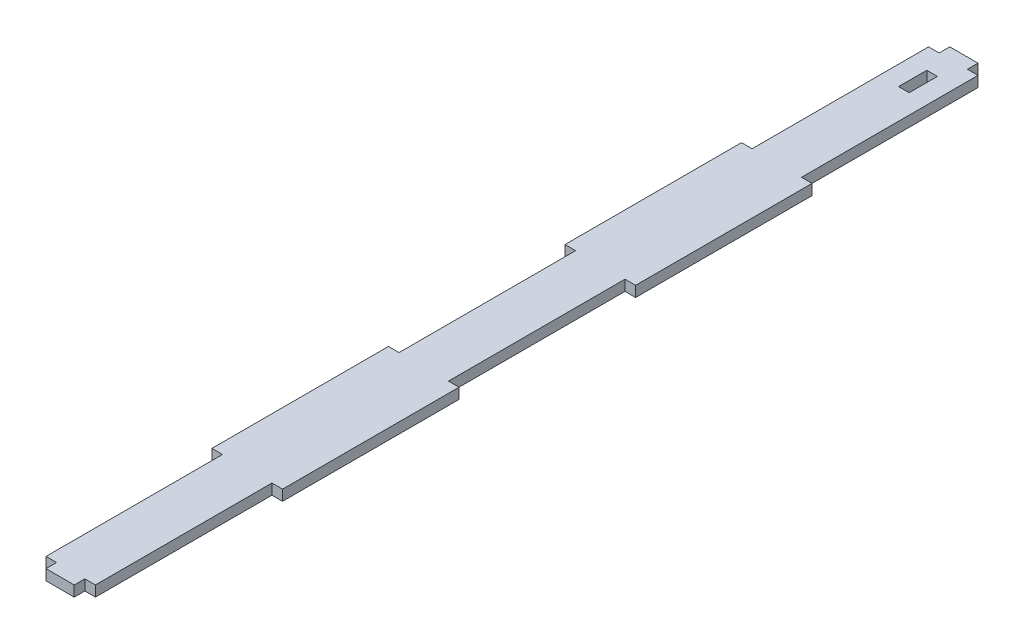
ISO-10303-21;
HEADER;
FILE_DESCRIPTION(('STEP AP214'),'2;1');
FILE_NAME('part.step','',(''),(''),'','','');
FILE_SCHEMA(('AUTOMOTIVE_DESIGN { 1 0 10303 214 1 1 1 1 }'));
ENDSEC;
DATA;
#1=APPLICATION_CONTEXT('core data for automotive mechanical design processes');
#2=APPLICATION_PROTOCOL_DEFINITION('international standard','automotive_design',2000,#1);
#3=PRODUCT_CONTEXT('',#1,'mechanical');
#4=PRODUCT('Part','Part','',(#3));
#5=PRODUCT_RELATED_PRODUCT_CATEGORY('part','',(#4));
#6=PRODUCT_DEFINITION_FORMATION('','',#4);
#7=PRODUCT_DEFINITION_CONTEXT('part definition',#1,'design');
#8=PRODUCT_DEFINITION('design','',#6,#7);
#9=PRODUCT_DEFINITION_SHAPE('','',#8);
#10=(LENGTH_UNIT() NAMED_UNIT(*) SI_UNIT(.MILLI.,.METRE.));
#11=(NAMED_UNIT(*) PLANE_ANGLE_UNIT() SI_UNIT($,.RADIAN.));
#12=(NAMED_UNIT(*) SI_UNIT($,.STERADIAN.) SOLID_ANGLE_UNIT());
#13=UNCERTAINTY_MEASURE_WITH_UNIT(LENGTH_MEASURE(1.E-05),#10,'distance_accuracy_value','');
#14=(GEOMETRIC_REPRESENTATION_CONTEXT(3) GLOBAL_UNCERTAINTY_ASSIGNED_CONTEXT((#13)) GLOBAL_UNIT_ASSIGNED_CONTEXT((#10,
#11,#12)) REPRESENTATION_CONTEXT('',''));
#15=CARTESIAN_POINT('',(0.,0.,0.));
#16=DIRECTION('',(0.,0.,1.));
#17=DIRECTION('',(1.,0.,0.));
#18=AXIS2_PLACEMENT_3D('',#15,#16,#17);
#19=CARTESIAN_POINT('',(2.99999999999996,3.,0.));
#20=DIRECTION('',(-1.,0.,0.));
#21=DIRECTION('',(0.,0.,1.));
#22=AXIS2_PLACEMENT_3D('',#19,#20,#21);
#23=PLANE('',#22);
#24=DIRECTION('',(0.,0.,-1.));
#25=VECTOR('',#24,1.);
#26=CARTESIAN_POINT('',(2.99999999999996,0.,0.));
#27=LINE('',#26,#25);
#28=CARTESIAN_POINT('',(2.99999999999996,0.,-200.116176228397));
#29=VERTEX_POINT('',#28);
#30=CARTESIAN_POINT('',(3.,0.,-250.116176228397));
#31=VERTEX_POINT('',#30);
#32=EDGE_CURVE('E295',#29,#31,#27,.T.);
#33=ORIENTED_EDGE('',*,*,#32,.F.);
#34=DIRECTION('',(0.,-1.,0.));
#35=VECTOR('',#34,1.);
#36=CARTESIAN_POINT('',(2.99999999999996,3.,-200.116176228397));
#37=LINE('',#36,#35);
#38=CARTESIAN_POINT('',(2.99999999999996,3.,-200.116176228397));
#39=VERTEX_POINT('',#38);
#40=EDGE_CURVE('E11',#39,#29,#37,.T.);
#41=ORIENTED_EDGE('',*,*,#40,.F.);
#42=DIRECTION('',(0.,0.,-1.));
#43=VECTOR('',#42,1.);
#44=CARTESIAN_POINT('',(2.99999999999996,3.,0.));
#45=LINE('',#44,#43);
#46=CARTESIAN_POINT('',(3.,3.,-250.116176228397));
#47=VERTEX_POINT('',#46);
#48=EDGE_CURVE('E452',#39,#47,#45,.T.);
#49=ORIENTED_EDGE('',*,*,#48,.T.);
#50=DIRECTION('',(0.,-1.,0.));
#51=VECTOR('',#50,1.);
#52=CARTESIAN_POINT('',(3.,3.,-250.116176228397));
#53=LINE('',#52,#51);
#54=EDGE_CURVE('E161',#47,#31,#53,.T.);
#55=ORIENTED_EDGE('',*,*,#54,.T.);
#56=EDGE_LOOP('',(#33,#41,#49,#55));
#57=FACE_BOUND('',#56,.T.);
#58=ADVANCED_FACE('F35',(#57),#23,.T.);
#59=CARTESIAN_POINT('',(0.,3.,-200.116176228397));
#60=DIRECTION('',(0.,0.,1.));
#61=DIRECTION('',(1.,0.,0.));
#62=AXIS2_PLACEMENT_3D('',#59,#60,#61);
#63=PLANE('',#62);
#64=DIRECTION('',(-1.,0.,0.));
#65=VECTOR('',#64,1.);
#66=CARTESIAN_POINT('',(0.,0.,-200.116176228397));
#67=LINE('',#66,#65);
#68=CARTESIAN_POINT('',(0.,0.,-200.116176228397));
#69=VERTEX_POINT('',#68);
#70=EDGE_CURVE('E297',#29,#69,#67,.T.);
#71=ORIENTED_EDGE('',*,*,#70,.T.);
#72=DIRECTION('',(0.,-1.,0.));
#73=VECTOR('',#72,1.);
#74=CARTESIAN_POINT('',(0.,3.,-200.116176228397));
#75=LINE('',#74,#73);
#76=CARTESIAN_POINT('',(0.,3.,-200.116176228397));
#77=VERTEX_POINT('',#76);
#78=EDGE_CURVE('E45',#77,#69,#75,.T.);
#79=ORIENTED_EDGE('',*,*,#78,.F.);
#80=DIRECTION('',(-1.,0.,0.));
#81=VECTOR('',#80,1.);
#82=CARTESIAN_POINT('',(0.,3.,-200.116176228397));
#83=LINE('',#82,#81);
#84=EDGE_CURVE('E454',#39,#77,#83,.T.);
#85=ORIENTED_EDGE('',*,*,#84,.F.);
#86=ORIENTED_EDGE('',*,*,#40,.T.);
#87=EDGE_LOOP('',(#71,#79,#85,#86));
#88=FACE_BOUND('',#87,.T.);
#89=ADVANCED_FACE('F537',(#88),#63,.F.);
#90=CARTESIAN_POINT('',(0.,3.,0.));
#91=DIRECTION('',(1.,0.,0.));
#92=DIRECTION('',(0.,0.,-1.));
#93=AXIS2_PLACEMENT_3D('',#90,#91,#92);
#94=PLANE('',#93);
#95=DIRECTION('',(0.,0.,1.));
#96=VECTOR('',#95,1.);
#97=CARTESIAN_POINT('',(0.,0.,0.));
#98=LINE('',#97,#96);
#99=CARTESIAN_POINT('',(0.,0.,-150.116176228397));
#100=VERTEX_POINT('',#99);
#101=EDGE_CURVE('E300',#69,#100,#98,.T.);
#102=ORIENTED_EDGE('',*,*,#101,.T.);
#103=DIRECTION('',(0.,-1.,0.));
#104=VECTOR('',#103,1.);
#105=CARTESIAN_POINT('',(0.,3.,-150.116176228397));
#106=LINE('',#105,#104);
#107=CARTESIAN_POINT('',(0.,3.,-150.116176228397));
#108=VERTEX_POINT('',#107);
#109=EDGE_CURVE('E422',#108,#100,#106,.T.);
#110=ORIENTED_EDGE('',*,*,#109,.F.);
#111=DIRECTION('',(0.,0.,1.));
#112=VECTOR('',#111,1.);
#113=CARTESIAN_POINT('',(0.,3.,0.));
#114=LINE('',#113,#112);
#115=EDGE_CURVE('E460',#77,#108,#114,.T.);
#116=ORIENTED_EDGE('',*,*,#115,.F.);
#117=ORIENTED_EDGE('',*,*,#78,.T.);
#118=EDGE_LOOP('',(#102,#110,#116,#117));
#119=FACE_BOUND('',#118,.T.);
#120=ADVANCED_FACE('F542',(#119),#94,.F.);
#121=CARTESIAN_POINT('',(1.38885362681212E-12,3.,-150.116176228397));
#122=DIRECTION('',(0.,0.,-1.));
#123=DIRECTION('',(-1.,0.,0.));
#124=AXIS2_PLACEMENT_3D('',#121,#122,#123);
#125=PLANE('',#124);
#126=DIRECTION('',(1.,0.,0.));
#127=VECTOR('',#126,1.);
#128=CARTESIAN_POINT('',(1.38885362681212E-12,0.,-150.116176228397));
#129=LINE('',#128,#127);
#130=CARTESIAN_POINT('',(2.99999999999996,0.,-150.116176228397));
#131=VERTEX_POINT('',#130);
#132=EDGE_CURVE('E303',#100,#131,#129,.T.);
#133=ORIENTED_EDGE('',*,*,#132,.T.);
#134=DIRECTION('',(0.,-1.,0.));
#135=VECTOR('',#134,1.);
#136=CARTESIAN_POINT('',(2.99999999999996,3.,-150.116176228397));
#137=LINE('',#136,#135);
#138=CARTESIAN_POINT('',(2.99999999999996,3.,-150.116176228397));
#139=VERTEX_POINT('',#138);
#140=EDGE_CURVE('E420',#139,#131,#137,.T.);
#141=ORIENTED_EDGE('',*,*,#140,.F.);
#142=DIRECTION('',(1.,0.,0.));
#143=VECTOR('',#142,1.);
#144=CARTESIAN_POINT('',(1.38885362681212E-12,3.,-150.116176228397));
#145=LINE('',#144,#143);
#146=EDGE_CURVE('E463',#108,#139,#145,.T.);
#147=ORIENTED_EDGE('',*,*,#146,.F.);
#148=ORIENTED_EDGE('',*,*,#109,.T.);
#149=EDGE_LOOP('',(#133,#141,#147,#148));
#150=FACE_BOUND('',#149,.T.);
#151=ADVANCED_FACE('F642',(#150),#125,.F.);
#152=CARTESIAN_POINT('',(2.99999999999997,3.,0.));
#153=DIRECTION('',(-1.,0.,0.));
#154=DIRECTION('',(0.,0.,1.));
#155=AXIS2_PLACEMENT_3D('',#152,#153,#154);
#156=PLANE('',#155);
#157=DIRECTION('',(0.,0.,-1.));
#158=VECTOR('',#157,1.);
#159=CARTESIAN_POINT('',(2.99999999999997,0.,0.));
#160=LINE('',#159,#158);
#161=CARTESIAN_POINT('',(2.99999999999996,0.,-100.116176228397));
#162=VERTEX_POINT('',#161);
#163=EDGE_CURVE('E306',#162,#131,#160,.T.);
#164=ORIENTED_EDGE('',*,*,#163,.F.);
#165=DIRECTION('',(0.,-1.,0.));
#166=VECTOR('',#165,1.);
#167=CARTESIAN_POINT('',(2.99999999999996,3.,-100.116176228397));
#168=LINE('',#167,#166);
#169=CARTESIAN_POINT('',(2.99999999999996,3.,-100.116176228397));
#170=VERTEX_POINT('',#169);
#171=EDGE_CURVE('E418',#170,#162,#168,.T.);
#172=ORIENTED_EDGE('',*,*,#171,.F.);
#173=DIRECTION('',(0.,0.,-1.));
#174=VECTOR('',#173,1.);
#175=CARTESIAN_POINT('',(2.99999999999997,3.,0.));
#176=LINE('',#175,#174);
#177=EDGE_CURVE('E465',#170,#139,#176,.T.);
#178=ORIENTED_EDGE('',*,*,#177,.T.);
#179=ORIENTED_EDGE('',*,*,#140,.T.);
#180=EDGE_LOOP('',(#164,#172,#178,#179));
#181=FACE_BOUND('',#180,.T.);
#182=ADVANCED_FACE('F638',(#181),#156,.T.);
#183=CARTESIAN_POINT('',(0.,3.,-100.116176228397));
#184=DIRECTION('',(0.,0.,1.));
#185=DIRECTION('',(1.,0.,0.));
#186=AXIS2_PLACEMENT_3D('',#183,#184,#185);
#187=PLANE('',#186);
#188=DIRECTION('',(-1.,0.,0.));
#189=VECTOR('',#188,1.);
#190=CARTESIAN_POINT('',(0.,0.,-100.116176228397));
#191=LINE('',#190,#189);
#192=CARTESIAN_POINT('',(0.,0.,-100.116176228397));
#193=VERTEX_POINT('',#192);
#194=EDGE_CURVE('E309',#162,#193,#191,.T.);
#195=ORIENTED_EDGE('',*,*,#194,.T.);
#196=DIRECTION('',(0.,-1.,0.));
#197=VECTOR('',#196,1.);
#198=CARTESIAN_POINT('',(0.,3.,-100.116176228397));
#199=LINE('',#198,#197);
#200=CARTESIAN_POINT('',(0.,3.,-100.116176228397));
#201=VERTEX_POINT('',#200);
#202=EDGE_CURVE('E415',#201,#193,#199,.T.);
#203=ORIENTED_EDGE('',*,*,#202,.F.);
#204=DIRECTION('',(-1.,0.,0.));
#205=VECTOR('',#204,1.);
#206=CARTESIAN_POINT('',(0.,3.,-100.116176228397));
#207=LINE('',#206,#205);
#208=EDGE_CURVE('E468',#170,#201,#207,.T.);
#209=ORIENTED_EDGE('',*,*,#208,.F.);
#210=ORIENTED_EDGE('',*,*,#171,.T.);
#211=EDGE_LOOP('',(#195,#203,#209,#210));
#212=FACE_BOUND('',#211,.T.);
#213=ADVANCED_FACE('F634',(#212),#187,.F.);
#214=CARTESIAN_POINT('',(0.,3.,0.));
#215=DIRECTION('',(1.,0.,0.));
#216=DIRECTION('',(0.,0.,-1.));
#217=AXIS2_PLACEMENT_3D('',#214,#215,#216);
#218=PLANE('',#217);
#219=DIRECTION('',(0.,0.,1.));
#220=VECTOR('',#219,1.);
#221=CARTESIAN_POINT('',(0.,0.,0.));
#222=LINE('',#221,#220);
#223=CARTESIAN_POINT('',(0.,0.,-50.1161762283972));
#224=VERTEX_POINT('',#223);
#225=EDGE_CURVE('E312',#193,#224,#222,.T.);
#226=ORIENTED_EDGE('',*,*,#225,.T.);
#227=DIRECTION('',(0.,-1.,0.));
#228=VECTOR('',#227,1.);
#229=CARTESIAN_POINT('',(0.,3.,-50.1161762283972));
#230=LINE('',#229,#228);
#231=CARTESIAN_POINT('',(0.,3.,-50.1161762283972));
#232=VERTEX_POINT('',#231);
#233=EDGE_CURVE('E413',#232,#224,#230,.T.);
#234=ORIENTED_EDGE('',*,*,#233,.F.);
#235=DIRECTION('',(0.,0.,1.));
#236=VECTOR('',#235,1.);
#237=CARTESIAN_POINT('',(0.,3.,0.));
#238=LINE('',#237,#236);
#239=EDGE_CURVE('E471',#201,#232,#238,.T.);
#240=ORIENTED_EDGE('',*,*,#239,.F.);
#241=ORIENTED_EDGE('',*,*,#202,.T.);
#242=EDGE_LOOP('',(#226,#234,#240,#241));
#243=FACE_BOUND('',#242,.T.);
#244=ADVANCED_FACE('F630',(#243),#218,.F.);
#245=CARTESIAN_POINT('',(0.,3.,-50.1161762283972));
#246=DIRECTION('',(0.,0.,1.));
#247=DIRECTION('',(1.,0.,0.));
#248=AXIS2_PLACEMENT_3D('',#245,#246,#247);
#249=PLANE('',#248);
#250=DIRECTION('',(-1.,0.,0.));
#251=VECTOR('',#250,1.);
#252=CARTESIAN_POINT('',(0.,0.,-50.1161762283972));
#253=LINE('',#252,#251);
#254=CARTESIAN_POINT('',(2.99999999999996,0.,-50.1161762283972));
#255=VERTEX_POINT('',#254);
#256=EDGE_CURVE('E315',#255,#224,#253,.T.);
#257=ORIENTED_EDGE('',*,*,#256,.F.);
#258=DIRECTION('',(0.,-1.,0.));
#259=VECTOR('',#258,1.);
#260=CARTESIAN_POINT('',(2.99999999999996,3.,-50.1161762283972));
#261=LINE('',#260,#259);
#262=CARTESIAN_POINT('',(2.99999999999996,3.,-50.1161762283972));
#263=VERTEX_POINT('',#262);
#264=EDGE_CURVE('E411',#263,#255,#261,.T.);
#265=ORIENTED_EDGE('',*,*,#264,.F.);
#266=DIRECTION('',(-1.,0.,0.));
#267=VECTOR('',#266,1.);
#268=CARTESIAN_POINT('',(0.,3.,-50.1161762283972));
#269=LINE('',#268,#267);
#270=EDGE_CURVE('E473',#263,#232,#269,.T.);
#271=ORIENTED_EDGE('',*,*,#270,.T.);
#272=ORIENTED_EDGE('',*,*,#233,.T.);
#273=EDGE_LOOP('',(#257,#265,#271,#272));
#274=FACE_BOUND('',#273,.T.);
#275=ADVANCED_FACE('F626',(#274),#249,.T.);
#276=CARTESIAN_POINT('',(2.99999999999996,3.,0.));
#277=DIRECTION('',(-1.,0.,0.));
#278=DIRECTION('',(0.,0.,1.));
#279=AXIS2_PLACEMENT_3D('',#276,#277,#278);
#280=PLANE('',#279);
#281=DIRECTION('',(0.,0.,-1.));
#282=VECTOR('',#281,1.);
#283=CARTESIAN_POINT('',(2.99999999999996,0.,0.));
#284=LINE('',#283,#282);
#285=CARTESIAN_POINT('',(2.99999999999996,0.,-0.116176228397226));
#286=VERTEX_POINT('',#285);
#287=EDGE_CURVE('E318',#286,#255,#284,.T.);
#288=ORIENTED_EDGE('',*,*,#287,.F.);
#289=DIRECTION('',(0.,-1.,0.));
#290=VECTOR('',#289,1.);
#291=CARTESIAN_POINT('',(2.99999999999996,3.,-0.116176228397226));
#292=LINE('',#291,#290);
#293=CARTESIAN_POINT('',(2.99999999999996,3.,-0.116176228397226));
#294=VERTEX_POINT('',#293);
#295=EDGE_CURVE('E409',#294,#286,#292,.T.);
#296=ORIENTED_EDGE('',*,*,#295,.F.);
#297=DIRECTION('',(0.,0.,-1.));
#298=VECTOR('',#297,1.);
#299=CARTESIAN_POINT('',(2.99999999999996,3.,0.));
#300=LINE('',#299,#298);
#301=EDGE_CURVE('E476',#294,#263,#300,.T.);
#302=ORIENTED_EDGE('',*,*,#301,.T.);
#303=ORIENTED_EDGE('',*,*,#264,.T.);
#304=EDGE_LOOP('',(#288,#296,#302,#303));
#305=FACE_BOUND('',#304,.T.);
#306=ADVANCED_FACE('F622',(#305),#280,.T.);
#307=CARTESIAN_POINT('',(0.,3.,-0.116176228397225));
#308=DIRECTION('',(0.,0.,1.));
#309=DIRECTION('',(1.,0.,0.));
#310=AXIS2_PLACEMENT_3D('',#307,#308,#309);
#311=PLANE('',#310);
#312=DIRECTION('',(-1.,0.,0.));
#313=VECTOR('',#312,1.);
#314=CARTESIAN_POINT('',(0.,0.,-0.116176228397225));
#315=LINE('',#314,#313);
#316=CARTESIAN_POINT('',(5.99999999999995,0.,-0.116176228397226));
#317=VERTEX_POINT('',#316);
#318=EDGE_CURVE('E321',#317,#286,#315,.T.);
#319=ORIENTED_EDGE('',*,*,#318,.F.);
#320=DIRECTION('',(0.,-1.,0.));
#321=VECTOR('',#320,1.);
#322=CARTESIAN_POINT('',(5.99999999999995,3.,-0.116176228397226));
#323=LINE('',#322,#321);
#324=CARTESIAN_POINT('',(5.99999999999995,3.,-0.116176228397226));
#325=VERTEX_POINT('',#324);
#326=EDGE_CURVE('E407',#325,#317,#323,.T.);
#327=ORIENTED_EDGE('',*,*,#326,.F.);
#328=DIRECTION('',(-1.,0.,0.));
#329=VECTOR('',#328,1.);
#330=CARTESIAN_POINT('',(0.,3.,-0.116176228397225));
#331=LINE('',#330,#329);
#332=EDGE_CURVE('E479',#325,#294,#331,.T.);
#333=ORIENTED_EDGE('',*,*,#332,.T.);
#334=ORIENTED_EDGE('',*,*,#295,.T.);
#335=EDGE_LOOP('',(#319,#327,#333,#334));
#336=FACE_BOUND('',#335,.T.);
#337=ADVANCED_FACE('F618',(#336),#311,.T.);
#338=CARTESIAN_POINT('',(5.99999999999995,3.,0.));
#339=DIRECTION('',(-1.,0.,0.));
#340=DIRECTION('',(0.,0.,1.));
#341=AXIS2_PLACEMENT_3D('',#338,#339,#340);
#342=PLANE('',#341);
#343=DIRECTION('',(0.,0.,-1.));
#344=VECTOR('',#343,1.);
#345=CARTESIAN_POINT('',(5.99999999999995,0.,0.));
#346=LINE('',#345,#344);
#347=CARTESIAN_POINT('',(5.99999999999995,0.,2.88382377160276));
#348=VERTEX_POINT('',#347);
#349=EDGE_CURVE('E324',#348,#317,#346,.T.);
#350=ORIENTED_EDGE('',*,*,#349,.F.);
#351=DIRECTION('',(0.,-1.,0.));
#352=VECTOR('',#351,1.);
#353=CARTESIAN_POINT('',(5.99999999999995,3.,2.88382377160276));
#354=LINE('',#353,#352);
#355=CARTESIAN_POINT('',(5.99999999999995,3.,2.88382377160276));
#356=VERTEX_POINT('',#355);
#357=EDGE_CURVE('E405',#356,#348,#354,.T.);
#358=ORIENTED_EDGE('',*,*,#357,.F.);
#359=DIRECTION('',(0.,0.,-1.));
#360=VECTOR('',#359,1.);
#361=CARTESIAN_POINT('',(5.99999999999995,3.,0.));
#362=LINE('',#361,#360);
#363=EDGE_CURVE('E482',#356,#325,#362,.T.);
#364=ORIENTED_EDGE('',*,*,#363,.T.);
#365=ORIENTED_EDGE('',*,*,#326,.T.);
#366=EDGE_LOOP('',(#350,#358,#364,#365));
#367=FACE_BOUND('',#366,.T.);
#368=ADVANCED_FACE('F614',(#367),#342,.T.);
#369=CARTESIAN_POINT('',(0.,3.,2.88382377160276));
#370=DIRECTION('',(0.,0.,1.));
#371=DIRECTION('',(1.,0.,0.));
#372=AXIS2_PLACEMENT_3D('',#369,#370,#371);
#373=PLANE('',#372);
#374=DIRECTION('',(-1.,0.,0.));
#375=VECTOR('',#374,1.);
#376=CARTESIAN_POINT('',(0.,0.,2.88382377160276));
#377=LINE('',#376,#375);
#378=CARTESIAN_POINT('',(14.,0.,2.88382377160276));
#379=VERTEX_POINT('',#378);
#380=EDGE_CURVE('E327',#379,#348,#377,.T.);
#381=ORIENTED_EDGE('',*,*,#380,.F.);
#382=DIRECTION('',(0.,-1.,0.));
#383=VECTOR('',#382,1.);
#384=CARTESIAN_POINT('',(14.,3.,2.88382377160276));
#385=LINE('',#384,#383);
#386=CARTESIAN_POINT('',(14.,3.,2.88382377160276));
#387=VERTEX_POINT('',#386);
#388=EDGE_CURVE('E403',#387,#379,#385,.T.);
#389=ORIENTED_EDGE('',*,*,#388,.F.);
#390=DIRECTION('',(-1.,0.,0.));
#391=VECTOR('',#390,1.);
#392=CARTESIAN_POINT('',(0.,3.,2.88382377160276));
#393=LINE('',#392,#391);
#394=EDGE_CURVE('E485',#387,#356,#393,.T.);
#395=ORIENTED_EDGE('',*,*,#394,.T.);
#396=ORIENTED_EDGE('',*,*,#357,.T.);
#397=EDGE_LOOP('',(#381,#389,#395,#396));
#398=FACE_BOUND('',#397,.T.);
#399=ADVANCED_FACE('F610',(#398),#373,.T.);
#400=CARTESIAN_POINT('',(14.,3.,0.));
#401=DIRECTION('',(-1.,0.,0.));
#402=DIRECTION('',(0.,0.,1.));
#403=AXIS2_PLACEMENT_3D('',#400,#401,#402);
#404=PLANE('',#403);
#405=DIRECTION('',(0.,0.,-1.));
#406=VECTOR('',#405,1.);
#407=CARTESIAN_POINT('',(14.,0.,0.));
#408=LINE('',#407,#406);
#409=CARTESIAN_POINT('',(14.,0.,-0.116176228397227));
#410=VERTEX_POINT('',#409);
#411=EDGE_CURVE('E330',#379,#410,#408,.T.);
#412=ORIENTED_EDGE('',*,*,#411,.T.);
#413=DIRECTION('',(0.,-1.,0.));
#414=VECTOR('',#413,1.);
#415=CARTESIAN_POINT('',(14.,3.,-0.116176228397227));
#416=LINE('',#415,#414);
#417=CARTESIAN_POINT('',(14.,3.,-0.116176228397227));
#418=VERTEX_POINT('',#417);
#419=EDGE_CURVE('E401',#418,#410,#416,.T.);
#420=ORIENTED_EDGE('',*,*,#419,.F.);
#421=DIRECTION('',(0.,0.,-1.));
#422=VECTOR('',#421,1.);
#423=CARTESIAN_POINT('',(14.,3.,0.));
#424=LINE('',#423,#422);
#425=EDGE_CURVE('E488',#387,#418,#424,.T.);
#426=ORIENTED_EDGE('',*,*,#425,.F.);
#427=ORIENTED_EDGE('',*,*,#388,.T.);
#428=EDGE_LOOP('',(#412,#420,#426,#427));
#429=FACE_BOUND('',#428,.T.);
#430=ADVANCED_FACE('F606',(#429),#404,.F.);
#431=CARTESIAN_POINT('',(0.,3.,-0.116176228397225));
#432=DIRECTION('',(0.,0.,1.));
#433=DIRECTION('',(1.,0.,0.));
#434=AXIS2_PLACEMENT_3D('',#431,#432,#433);
#435=PLANE('',#434);
#436=DIRECTION('',(-1.,0.,0.));
#437=VECTOR('',#436,1.);
#438=CARTESIAN_POINT('',(0.,0.,-0.116176228397225));
#439=LINE('',#438,#437);
#440=CARTESIAN_POINT('',(17.,0.,-0.116176228397227));
#441=VERTEX_POINT('',#440);
#442=EDGE_CURVE('E333',#441,#410,#439,.T.);
#443=ORIENTED_EDGE('',*,*,#442,.F.);
#444=DIRECTION('',(0.,-1.,0.));
#445=VECTOR('',#444,1.);
#446=CARTESIAN_POINT('',(17.,3.,-0.116176228397227));
#447=LINE('',#446,#445);
#448=CARTESIAN_POINT('',(17.,3.,-0.116176228397227));
#449=VERTEX_POINT('',#448);
#450=EDGE_CURVE('E399',#449,#441,#447,.T.);
#451=ORIENTED_EDGE('',*,*,#450,.F.);
#452=DIRECTION('',(-1.,0.,0.));
#453=VECTOR('',#452,1.);
#454=CARTESIAN_POINT('',(0.,3.,-0.116176228397225));
#455=LINE('',#454,#453);
#456=EDGE_CURVE('E490',#449,#418,#455,.T.);
#457=ORIENTED_EDGE('',*,*,#456,.T.);
#458=ORIENTED_EDGE('',*,*,#419,.T.);
#459=EDGE_LOOP('',(#443,#451,#457,#458));
#460=FACE_BOUND('',#459,.T.);
#461=ADVANCED_FACE('F602',(#460),#435,.T.);
#462=CARTESIAN_POINT('',(17.,3.,0.));
#463=DIRECTION('',(1.,0.,0.));
#464=DIRECTION('',(0.,0.,-1.));
#465=AXIS2_PLACEMENT_3D('',#462,#463,#464);
#466=PLANE('',#465);
#467=DIRECTION('',(0.,0.,1.));
#468=VECTOR('',#467,1.);
#469=CARTESIAN_POINT('',(17.,0.,0.));
#470=LINE('',#469,#468);
#471=CARTESIAN_POINT('',(17.,0.,-50.1161762283972));
#472=VERTEX_POINT('',#471);
#473=EDGE_CURVE('E336',#472,#441,#470,.T.);
#474=ORIENTED_EDGE('',*,*,#473,.F.);
#475=DIRECTION('',(0.,-1.,0.));
#476=VECTOR('',#475,1.);
#477=CARTESIAN_POINT('',(17.,3.,-50.1161762283972));
#478=LINE('',#477,#476);
#479=CARTESIAN_POINT('',(17.,3.,-50.1161762283972));
#480=VERTEX_POINT('',#479);
#481=EDGE_CURVE('E397',#480,#472,#478,.T.);
#482=ORIENTED_EDGE('',*,*,#481,.F.);
#483=DIRECTION('',(0.,0.,1.));
#484=VECTOR('',#483,1.);
#485=CARTESIAN_POINT('',(17.,3.,0.));
#486=LINE('',#485,#484);
#487=EDGE_CURVE('E493',#480,#449,#486,.T.);
#488=ORIENTED_EDGE('',*,*,#487,.T.);
#489=ORIENTED_EDGE('',*,*,#450,.T.);
#490=EDGE_LOOP('',(#474,#482,#488,#489));
#491=FACE_BOUND('',#490,.T.);
#492=ADVANCED_FACE('F598',(#491),#466,.T.);
#493=CARTESIAN_POINT('',(0.,3.,-50.1161762283972));
#494=DIRECTION('',(0.,0.,-1.));
#495=DIRECTION('',(-1.,0.,0.));
#496=AXIS2_PLACEMENT_3D('',#493,#494,#495);
#497=PLANE('',#496);
#498=DIRECTION('',(1.,0.,0.));
#499=VECTOR('',#498,1.);
#500=CARTESIAN_POINT('',(0.,0.,-50.1161762283972));
#501=LINE('',#500,#499);
#502=CARTESIAN_POINT('',(20.,0.,-50.1161762283972));
#503=VERTEX_POINT('',#502);
#504=EDGE_CURVE('E339',#472,#503,#501,.T.);
#505=ORIENTED_EDGE('',*,*,#504,.T.);
#506=DIRECTION('',(0.,-1.,0.));
#507=VECTOR('',#506,1.);
#508=CARTESIAN_POINT('',(20.,3.,-50.1161762283972));
#509=LINE('',#508,#507);
#510=CARTESIAN_POINT('',(20.,3.,-50.1161762283972));
#511=VERTEX_POINT('',#510);
#512=EDGE_CURVE('E394',#511,#503,#509,.T.);
#513=ORIENTED_EDGE('',*,*,#512,.F.);
#514=DIRECTION('',(1.,0.,0.));
#515=VECTOR('',#514,1.);
#516=CARTESIAN_POINT('',(0.,3.,-50.1161762283972));
#517=LINE('',#516,#515);
#518=EDGE_CURVE('E496',#480,#511,#517,.T.);
#519=ORIENTED_EDGE('',*,*,#518,.F.);
#520=ORIENTED_EDGE('',*,*,#481,.T.);
#521=EDGE_LOOP('',(#505,#513,#519,#520));
#522=FACE_BOUND('',#521,.T.);
#523=ADVANCED_FACE('F594',(#522),#497,.F.);
#524=CARTESIAN_POINT('',(20.,3.,0.));
#525=DIRECTION('',(-1.,0.,0.));
#526=DIRECTION('',(0.,0.,1.));
#527=AXIS2_PLACEMENT_3D('',#524,#525,#526);
#528=PLANE('',#527);
#529=DIRECTION('',(0.,0.,-1.));
#530=VECTOR('',#529,1.);
#531=CARTESIAN_POINT('',(20.,0.,0.));
#532=LINE('',#531,#530);
#533=CARTESIAN_POINT('',(20.,0.,-100.116176228397));
#534=VERTEX_POINT('',#533);
#535=EDGE_CURVE('E342',#503,#534,#532,.T.);
#536=ORIENTED_EDGE('',*,*,#535,.T.);
#537=DIRECTION('',(0.,-1.,0.));
#538=VECTOR('',#537,1.);
#539=CARTESIAN_POINT('',(20.,3.,-100.116176228397));
#540=LINE('',#539,#538);
#541=CARTESIAN_POINT('',(20.,3.,-100.116176228397));
#542=VERTEX_POINT('',#541);
#543=EDGE_CURVE('E391',#542,#534,#540,.T.);
#544=ORIENTED_EDGE('',*,*,#543,.F.);
#545=DIRECTION('',(0.,0.,-1.));
#546=VECTOR('',#545,1.);
#547=CARTESIAN_POINT('',(20.,3.,0.));
#548=LINE('',#547,#546);
#549=EDGE_CURVE('E499',#511,#542,#548,.T.);
#550=ORIENTED_EDGE('',*,*,#549,.F.);
#551=ORIENTED_EDGE('',*,*,#512,.T.);
#552=EDGE_LOOP('',(#536,#544,#550,#551));
#553=FACE_BOUND('',#552,.T.);
#554=ADVANCED_FACE('F590',(#553),#528,.F.);
#555=CARTESIAN_POINT('',(0.,3.,-100.116176228397));
#556=DIRECTION('',(0.,0.,1.));
#557=DIRECTION('',(1.,0.,0.));
#558=AXIS2_PLACEMENT_3D('',#555,#556,#557);
#559=PLANE('',#558);
#560=DIRECTION('',(-1.,0.,0.));
#561=VECTOR('',#560,1.);
#562=CARTESIAN_POINT('',(0.,0.,-100.116176228397));
#563=LINE('',#562,#561);
#564=CARTESIAN_POINT('',(17.,0.,-100.116176228397));
#565=VERTEX_POINT('',#564);
#566=EDGE_CURVE('E345',#534,#565,#563,.T.);
#567=ORIENTED_EDGE('',*,*,#566,.T.);
#568=DIRECTION('',(0.,-1.,0.));
#569=VECTOR('',#568,1.);
#570=CARTESIAN_POINT('',(17.,3.,-100.116176228397));
#571=LINE('',#570,#569);
#572=CARTESIAN_POINT('',(17.,3.,-100.116176228397));
#573=VERTEX_POINT('',#572);
#574=EDGE_CURVE('E389',#573,#565,#571,.T.);
#575=ORIENTED_EDGE('',*,*,#574,.F.);
#576=DIRECTION('',(-1.,0.,0.));
#577=VECTOR('',#576,1.);
#578=CARTESIAN_POINT('',(0.,3.,-100.116176228397));
#579=LINE('',#578,#577);
#580=EDGE_CURVE('E502',#542,#573,#579,.T.);
#581=ORIENTED_EDGE('',*,*,#580,.F.);
#582=ORIENTED_EDGE('',*,*,#543,.T.);
#583=EDGE_LOOP('',(#567,#575,#581,#582));
#584=FACE_BOUND('',#583,.T.);
#585=ADVANCED_FACE('F586',(#584),#559,.F.);
#586=CARTESIAN_POINT('',(17.,3.,0.));
#587=DIRECTION('',(1.,0.,0.));
#588=DIRECTION('',(0.,0.,-1.));
#589=AXIS2_PLACEMENT_3D('',#586,#587,#588);
#590=PLANE('',#589);
#591=DIRECTION('',(0.,0.,1.));
#592=VECTOR('',#591,1.);
#593=CARTESIAN_POINT('',(17.,0.,0.));
#594=LINE('',#593,#592);
#595=CARTESIAN_POINT('',(17.,0.,-150.116176228397));
#596=VERTEX_POINT('',#595);
#597=EDGE_CURVE('E348',#596,#565,#594,.T.);
#598=ORIENTED_EDGE('',*,*,#597,.F.);
#599=DIRECTION('',(0.,-1.,0.));
#600=VECTOR('',#599,1.);
#601=CARTESIAN_POINT('',(17.,3.,-150.116176228397));
#602=LINE('',#601,#600);
#603=CARTESIAN_POINT('',(17.,3.,-150.116176228397));
#604=VERTEX_POINT('',#603);
#605=EDGE_CURVE('E387',#604,#596,#602,.T.);
#606=ORIENTED_EDGE('',*,*,#605,.F.);
#607=DIRECTION('',(0.,0.,1.));
#608=VECTOR('',#607,1.);
#609=CARTESIAN_POINT('',(17.,3.,0.));
#610=LINE('',#609,#608);
#611=EDGE_CURVE('E504',#604,#573,#610,.T.);
#612=ORIENTED_EDGE('',*,*,#611,.T.);
#613=ORIENTED_EDGE('',*,*,#574,.T.);
#614=EDGE_LOOP('',(#598,#606,#612,#613));
#615=FACE_BOUND('',#614,.T.);
#616=ADVANCED_FACE('F582',(#615),#590,.T.);
#617=CARTESIAN_POINT('',(0.,3.,-150.116176228397));
#618=DIRECTION('',(0.,0.,1.));
#619=DIRECTION('',(1.,0.,0.));
#620=AXIS2_PLACEMENT_3D('',#617,#618,#619);
#621=PLANE('',#620);
#622=DIRECTION('',(-1.,0.,0.));
#623=VECTOR('',#622,1.);
#624=CARTESIAN_POINT('',(0.,0.,-150.116176228397));
#625=LINE('',#624,#623);
#626=CARTESIAN_POINT('',(20.,0.,-150.116176228397));
#627=VERTEX_POINT('',#626);
#628=EDGE_CURVE('E351',#627,#596,#625,.T.);
#629=ORIENTED_EDGE('',*,*,#628,.F.);
#630=DIRECTION('',(0.,-1.,0.));
#631=VECTOR('',#630,1.);
#632=CARTESIAN_POINT('',(20.,3.,-150.116176228397));
#633=LINE('',#632,#631);
#634=CARTESIAN_POINT('',(20.,3.,-150.116176228397));
#635=VERTEX_POINT('',#634);
#636=EDGE_CURVE('E385',#635,#627,#633,.T.);
#637=ORIENTED_EDGE('',*,*,#636,.F.);
#638=DIRECTION('',(-1.,0.,0.));
#639=VECTOR('',#638,1.);
#640=CARTESIAN_POINT('',(0.,3.,-150.116176228397));
#641=LINE('',#640,#639);
#642=EDGE_CURVE('E507',#635,#604,#641,.T.);
#643=ORIENTED_EDGE('',*,*,#642,.T.);
#644=ORIENTED_EDGE('',*,*,#605,.T.);
#645=EDGE_LOOP('',(#629,#637,#643,#644));
#646=FACE_BOUND('',#645,.T.);
#647=ADVANCED_FACE('F578',(#646),#621,.T.);
#648=CARTESIAN_POINT('',(20.,3.,0.));
#649=DIRECTION('',(-1.,0.,0.));
#650=DIRECTION('',(0.,0.,1.));
#651=AXIS2_PLACEMENT_3D('',#648,#649,#650);
#652=PLANE('',#651);
#653=DIRECTION('',(0.,0.,-1.));
#654=VECTOR('',#653,1.);
#655=CARTESIAN_POINT('',(20.,0.,0.));
#656=LINE('',#655,#654);
#657=CARTESIAN_POINT('',(20.,0.,-200.116176228397));
#658=VERTEX_POINT('',#657);
#659=EDGE_CURVE('E354',#627,#658,#656,.T.);
#660=ORIENTED_EDGE('',*,*,#659,.T.);
#661=DIRECTION('',(0.,-1.,0.));
#662=VECTOR('',#661,1.);
#663=CARTESIAN_POINT('',(20.,3.,-200.116176228397));
#664=LINE('',#663,#662);
#665=CARTESIAN_POINT('',(20.,3.,-200.116176228397));
#666=VERTEX_POINT('',#665);
#667=EDGE_CURVE('E383',#666,#658,#664,.T.);
#668=ORIENTED_EDGE('',*,*,#667,.F.);
#669=DIRECTION('',(0.,0.,-1.));
#670=VECTOR('',#669,1.);
#671=CARTESIAN_POINT('',(20.,3.,0.));
#672=LINE('',#671,#670);
#673=EDGE_CURVE('E510',#635,#666,#672,.T.);
#674=ORIENTED_EDGE('',*,*,#673,.F.);
#675=ORIENTED_EDGE('',*,*,#636,.T.);
#676=EDGE_LOOP('',(#660,#668,#674,#675));
#677=FACE_BOUND('',#676,.T.);
#678=ADVANCED_FACE('F574',(#677),#652,.F.);
#679=CARTESIAN_POINT('',(0.,3.,-200.116176228397));
#680=DIRECTION('',(0.,0.,-1.));
#681=DIRECTION('',(-1.,0.,0.));
#682=AXIS2_PLACEMENT_3D('',#679,#680,#681);
#683=PLANE('',#682);
#684=DIRECTION('',(1.,0.,0.));
#685=VECTOR('',#684,1.);
#686=CARTESIAN_POINT('',(0.,0.,-200.116176228397));
#687=LINE('',#686,#685);
#688=CARTESIAN_POINT('',(17.,0.,-200.116176228397));
#689=VERTEX_POINT('',#688);
#690=EDGE_CURVE('E357',#689,#658,#687,.T.);
#691=ORIENTED_EDGE('',*,*,#690,.F.);
#692=DIRECTION('',(0.,-1.,0.));
#693=VECTOR('',#692,1.);
#694=CARTESIAN_POINT('',(17.,3.,-200.116176228397));
#695=LINE('',#694,#693);
#696=CARTESIAN_POINT('',(17.,3.,-200.116176228397));
#697=VERTEX_POINT('',#696);
#698=EDGE_CURVE('E381',#697,#689,#695,.T.);
#699=ORIENTED_EDGE('',*,*,#698,.F.);
#700=DIRECTION('',(1.,0.,0.));
#701=VECTOR('',#700,1.);
#702=CARTESIAN_POINT('',(0.,3.,-200.116176228397));
#703=LINE('',#702,#701);
#704=EDGE_CURVE('E512',#697,#666,#703,.T.);
#705=ORIENTED_EDGE('',*,*,#704,.T.);
#706=ORIENTED_EDGE('',*,*,#667,.T.);
#707=EDGE_LOOP('',(#691,#699,#705,#706));
#708=FACE_BOUND('',#707,.T.);
#709=ADVANCED_FACE('F570',(#708),#683,.T.);
#710=CARTESIAN_POINT('',(16.9999999999998,3.,0.));
#711=DIRECTION('',(1.,0.,0.));
#712=DIRECTION('',(0.,0.,-1.));
#713=AXIS2_PLACEMENT_3D('',#710,#711,#712);
#714=PLANE('',#713);
#715=DIRECTION('',(0.,0.,1.));
#716=VECTOR('',#715,1.);
#717=CARTESIAN_POINT('',(16.9999999999998,0.,0.));
#718=LINE('',#717,#716);
#719=CARTESIAN_POINT('',(17.,0.,-250.116176228397));
#720=VERTEX_POINT('',#719);
#721=EDGE_CURVE('E360',#720,#689,#718,.T.);
#722=ORIENTED_EDGE('',*,*,#721,.F.);
#723=DIRECTION('',(0.,-1.,0.));
#724=VECTOR('',#723,1.);
#725=CARTESIAN_POINT('',(17.,3.,-250.116176228397));
#726=LINE('',#725,#724);
#727=CARTESIAN_POINT('',(17.,3.,-250.116176228397));
#728=VERTEX_POINT('',#727);
#729=EDGE_CURVE('E379',#728,#720,#726,.T.);
#730=ORIENTED_EDGE('',*,*,#729,.F.);
#731=DIRECTION('',(0.,0.,1.));
#732=VECTOR('',#731,1.);
#733=CARTESIAN_POINT('',(16.9999999999998,3.,0.));
#734=LINE('',#733,#732);
#735=EDGE_CURVE('E515',#728,#697,#734,.T.);
#736=ORIENTED_EDGE('',*,*,#735,.T.);
#737=ORIENTED_EDGE('',*,*,#698,.T.);
#738=EDGE_LOOP('',(#722,#730,#736,#737));
#739=FACE_BOUND('',#738,.T.);
#740=ADVANCED_FACE('F567',(#739),#714,.T.);
#741=CARTESIAN_POINT('',(0.,3.,-250.116176228397));
#742=DIRECTION('',(0.,0.,1.));
#743=DIRECTION('',(1.,0.,0.));
#744=AXIS2_PLACEMENT_3D('',#741,#742,#743);
#745=PLANE('',#744);
#746=DIRECTION('',(-1.,0.,0.));
#747=VECTOR('',#746,1.);
#748=CARTESIAN_POINT('',(0.,0.,-250.116176228397));
#749=LINE('',#748,#747);
#750=CARTESIAN_POINT('',(14.,0.,-250.116176228397));
#751=VERTEX_POINT('',#750);
#752=EDGE_CURVE('E363',#720,#751,#749,.T.);
#753=ORIENTED_EDGE('',*,*,#752,.T.);
#754=DIRECTION('',(0.,-1.,0.));
#755=VECTOR('',#754,1.);
#756=CARTESIAN_POINT('',(14.,3.,-250.116176228397));
#757=LINE('',#756,#755);
#758=CARTESIAN_POINT('',(14.,3.,-250.116176228397));
#759=VERTEX_POINT('',#758);
#760=EDGE_CURVE('E377',#759,#751,#757,.T.);
#761=ORIENTED_EDGE('',*,*,#760,.F.);
#762=DIRECTION('',(-1.,0.,0.));
#763=VECTOR('',#762,1.);
#764=CARTESIAN_POINT('',(0.,3.,-250.116176228397));
#765=LINE('',#764,#763);
#766=EDGE_CURVE('E277',#728,#759,#765,.T.);
#767=ORIENTED_EDGE('',*,*,#766,.F.);
#768=ORIENTED_EDGE('',*,*,#729,.T.);
#769=EDGE_LOOP('',(#753,#761,#767,#768));
#770=FACE_BOUND('',#769,.T.);
#771=ADVANCED_FACE('F522',(#770),#745,.F.);
#772=CARTESIAN_POINT('',(14.,3.,0.));
#773=DIRECTION('',(1.,0.,0.));
#774=DIRECTION('',(0.,0.,-1.));
#775=AXIS2_PLACEMENT_3D('',#772,#773,#774);
#776=PLANE('',#775);
#777=DIRECTION('',(0.,0.,1.));
#778=VECTOR('',#777,1.);
#779=CARTESIAN_POINT('',(14.,0.,0.));
#780=LINE('',#779,#778);
#781=CARTESIAN_POINT('',(14.,0.,-253.116176228397));
#782=VERTEX_POINT('',#781);
#783=EDGE_CURVE('E366',#782,#751,#780,.T.);
#784=ORIENTED_EDGE('',*,*,#783,.F.);
#785=DIRECTION('',(0.,-1.,0.));
#786=VECTOR('',#785,1.);
#787=CARTESIAN_POINT('',(14.,3.,-253.116176228397));
#788=LINE('',#787,#786);
#789=CARTESIAN_POINT('',(14.,3.,-253.116176228397));
#790=VERTEX_POINT('',#789);
#791=EDGE_CURVE('E265',#790,#782,#788,.T.);
#792=ORIENTED_EDGE('',*,*,#791,.F.);
#793=DIRECTION('',(0.,0.,1.));
#794=VECTOR('',#793,1.);
#795=CARTESIAN_POINT('',(14.,3.,0.));
#796=LINE('',#795,#794);
#797=EDGE_CURVE('E275',#790,#759,#796,.T.);
#798=ORIENTED_EDGE('',*,*,#797,.T.);
#799=ORIENTED_EDGE('',*,*,#760,.T.);
#800=EDGE_LOOP('',(#784,#792,#798,#799));
#801=FACE_BOUND('',#800,.T.);
#802=ADVANCED_FACE('F526',(#801),#776,.T.);
#803=CARTESIAN_POINT('',(0.,3.,-253.116176228397));
#804=DIRECTION('',(0.,0.,-1.));
#805=DIRECTION('',(-1.,0.,0.));
#806=AXIS2_PLACEMENT_3D('',#803,#804,#805);
#807=PLANE('',#806);
#808=DIRECTION('',(1.,0.,0.));
#809=VECTOR('',#808,1.);
#810=CARTESIAN_POINT('',(0.,0.,-253.116176228397));
#811=LINE('',#810,#809);
#812=CARTESIAN_POINT('',(6.,0.,-253.116176228397));
#813=VERTEX_POINT('',#812);
#814=EDGE_CURVE('E262',#813,#782,#811,.T.);
#815=ORIENTED_EDGE('',*,*,#814,.F.);
#816=DIRECTION('',(0.,-1.,0.));
#817=VECTOR('',#816,1.);
#818=CARTESIAN_POINT('',(6.,3.,-253.116176228397));
#819=LINE('',#818,#817);
#820=CARTESIAN_POINT('',(6.,3.,-253.116176228397));
#821=VERTEX_POINT('',#820);
#822=EDGE_CURVE('E256',#821,#813,#819,.T.);
#823=ORIENTED_EDGE('',*,*,#822,.F.);
#824=DIRECTION('',(1.,0.,0.));
#825=VECTOR('',#824,1.);
#826=CARTESIAN_POINT('',(0.,3.,-253.116176228397));
#827=LINE('',#826,#825);
#828=EDGE_CURVE('E260',#821,#790,#827,.T.);
#829=ORIENTED_EDGE('',*,*,#828,.T.);
#830=ORIENTED_EDGE('',*,*,#791,.T.);
#831=EDGE_LOOP('',(#815,#823,#829,#830));
#832=FACE_BOUND('',#831,.T.);
#833=ADVANCED_FACE('F258',(#832),#807,.T.);
#834=CARTESIAN_POINT('',(6.,3.,0.));
#835=DIRECTION('',(1.,0.,0.));
#836=DIRECTION('',(0.,0.,-1.));
#837=AXIS2_PLACEMENT_3D('',#834,#835,#836);
#838=PLANE('',#837);
#839=DIRECTION('',(0.,0.,1.));
#840=VECTOR('',#839,1.);
#841=CARTESIAN_POINT('',(6.,0.,0.));
#842=LINE('',#841,#840);
#843=CARTESIAN_POINT('',(6.,0.,-250.116176228397));
#844=VERTEX_POINT('',#843);
#845=EDGE_CURVE('E370',#813,#844,#842,.T.);
#846=ORIENTED_EDGE('',*,*,#845,.T.);
#847=DIRECTION('',(0.,-1.,0.));
#848=VECTOR('',#847,1.);
#849=CARTESIAN_POINT('',(6.,3.,-250.116176228397));
#850=LINE('',#849,#848);
#851=CARTESIAN_POINT('',(6.,3.,-250.116176228397));
#852=VERTEX_POINT('',#851);
#853=EDGE_CURVE('E266',#852,#844,#850,.T.);
#854=ORIENTED_EDGE('',*,*,#853,.F.);
#855=DIRECTION('',(0.,0.,1.));
#856=VECTOR('',#855,1.);
#857=CARTESIAN_POINT('',(6.,3.,0.));
#858=LINE('',#857,#856);
#859=EDGE_CURVE('E269',#821,#852,#858,.T.);
#860=ORIENTED_EDGE('',*,*,#859,.F.);
#861=ORIENTED_EDGE('',*,*,#822,.T.);
#862=EDGE_LOOP('',(#846,#854,#860,#861));
#863=FACE_BOUND('',#862,.T.);
#864=ADVANCED_FACE('F270',(#863),#838,.F.);
#865=CARTESIAN_POINT('',(8.49999999999999,3.,0.));
#866=DIRECTION('',(1.,0.,0.));
#867=DIRECTION('',(0.,0.,-1.));
#868=AXIS2_PLACEMENT_3D('',#865,#866,#867);
#869=PLANE('',#868);
#870=DIRECTION('',(0.,0.,1.));
#871=VECTOR('',#870,1.);
#872=CARTESIAN_POINT('',(8.49999999999999,0.,0.));
#873=LINE('',#872,#871);
#874=CARTESIAN_POINT('',(8.49999999999999,0.,-244.116176228397));
#875=VERTEX_POINT('',#874);
#876=CARTESIAN_POINT('',(8.49999999999999,0.,-236.116176228397));
#877=VERTEX_POINT('',#876);
#878=EDGE_CURVE('E283',#875,#877,#873,.T.);
#879=ORIENTED_EDGE('',*,*,#878,.F.);
#880=DIRECTION('',(0.,-1.,0.));
#881=VECTOR('',#880,1.);
#882=CARTESIAN_POINT('',(8.49999999999999,3.,-244.116176228397));
#883=LINE('',#882,#881);
#884=CARTESIAN_POINT('',(8.49999999999999,3.,-244.116176228397));
#885=VERTEX_POINT('',#884);
#886=EDGE_CURVE('E39',#885,#875,#883,.T.);
#887=ORIENTED_EDGE('',*,*,#886,.F.);
#888=DIRECTION('',(0.,0.,1.));
#889=VECTOR('',#888,1.);
#890=CARTESIAN_POINT('',(8.49999999999999,3.,0.));
#891=LINE('',#890,#889);
#892=CARTESIAN_POINT('',(8.49999999999999,3.,-236.116176228397));
#893=VERTEX_POINT('',#892);
#894=EDGE_CURVE('E373',#885,#893,#891,.T.);
#895=ORIENTED_EDGE('',*,*,#894,.T.);
#896=DIRECTION('',(0.,-1.,0.));
#897=VECTOR('',#896,1.);
#898=CARTESIAN_POINT('',(8.49999999999999,3.,-236.116176228397));
#899=LINE('',#898,#897);
#900=EDGE_CURVE('E282',#893,#877,#899,.T.);
#901=ORIENTED_EDGE('',*,*,#900,.T.);
#902=EDGE_LOOP('',(#879,#887,#895,#901));
#903=FACE_BOUND('',#902,.T.);
#904=ADVANCED_FACE('F37',(#903),#869,.T.);
#905=CARTESIAN_POINT('',(0.,3.,-244.116176228397));
#906=DIRECTION('',(0.,0.,1.));
#907=DIRECTION('',(1.,0.,0.));
#908=AXIS2_PLACEMENT_3D('',#905,#906,#907);
#909=PLANE('',#908);
#910=DIRECTION('',(-1.,0.,0.));
#911=VECTOR('',#910,1.);
#912=CARTESIAN_POINT('',(0.,0.,-244.116176228397));
#913=LINE('',#912,#911);
#914=CARTESIAN_POINT('',(11.5,0.,-244.116176228397));
#915=VERTEX_POINT('',#914);
#916=EDGE_CURVE('E286',#915,#875,#913,.T.);
#917=ORIENTED_EDGE('',*,*,#916,.F.);
#918=DIRECTION('',(0.,-1.,0.));
#919=VECTOR('',#918,1.);
#920=CARTESIAN_POINT('',(11.5,3.,-244.116176228397));
#921=LINE('',#920,#919);
#922=CARTESIAN_POINT('',(11.5,3.,-244.116176228397));
#923=VERTEX_POINT('',#922);
#924=EDGE_CURVE('E429',#923,#915,#921,.T.);
#925=ORIENTED_EDGE('',*,*,#924,.F.);
#926=DIRECTION('',(-1.,0.,0.));
#927=VECTOR('',#926,1.);
#928=CARTESIAN_POINT('',(0.,3.,-244.116176228397));
#929=LINE('',#928,#927);
#930=EDGE_CURVE('E438',#923,#885,#929,.T.);
#931=ORIENTED_EDGE('',*,*,#930,.T.);
#932=ORIENTED_EDGE('',*,*,#886,.T.);
#933=EDGE_LOOP('',(#917,#925,#931,#932));
#934=FACE_BOUND('',#933,.T.);
#935=ADVANCED_FACE('F436',(#934),#909,.T.);
#936=CARTESIAN_POINT('',(11.5,3.,0.));
#937=DIRECTION('',(-1.,0.,0.));
#938=DIRECTION('',(0.,0.,1.));
#939=AXIS2_PLACEMENT_3D('',#936,#937,#938);
#940=PLANE('',#939);
#941=DIRECTION('',(0.,0.,-1.));
#942=VECTOR('',#941,1.);
#943=CARTESIAN_POINT('',(11.5,0.,0.));
#944=LINE('',#943,#942);
#945=CARTESIAN_POINT('',(11.5,0.,-236.116176228397));
#946=VERTEX_POINT('',#945);
#947=EDGE_CURVE('E289',#946,#915,#944,.T.);
#948=ORIENTED_EDGE('',*,*,#947,.F.);
#949=DIRECTION('',(0.,-1.,0.));
#950=VECTOR('',#949,1.);
#951=CARTESIAN_POINT('',(11.5,3.,-236.116176228397));
#952=LINE('',#951,#950);
#953=CARTESIAN_POINT('',(11.5,3.,-236.116176228397));
#954=VERTEX_POINT('',#953);
#955=EDGE_CURVE('E428',#954,#946,#952,.T.);
#956=ORIENTED_EDGE('',*,*,#955,.F.);
#957=DIRECTION('',(0.,0.,-1.));
#958=VECTOR('',#957,1.);
#959=CARTESIAN_POINT('',(11.5,3.,0.));
#960=LINE('',#959,#958);
#961=EDGE_CURVE('E444',#954,#923,#960,.T.);
#962=ORIENTED_EDGE('',*,*,#961,.T.);
#963=ORIENTED_EDGE('',*,*,#924,.T.);
#964=EDGE_LOOP('',(#948,#956,#962,#963));
#965=FACE_BOUND('',#964,.T.);
#966=ADVANCED_FACE('F442',(#965),#940,.T.);
#967=CARTESIAN_POINT('',(0.,3.,-236.116176228397));
#968=DIRECTION('',(0.,0.,-1.));
#969=DIRECTION('',(-1.,0.,0.));
#970=AXIS2_PLACEMENT_3D('',#967,#968,#969);
#971=PLANE('',#970);
#972=DIRECTION('',(1.,0.,0.));
#973=VECTOR('',#972,1.);
#974=CARTESIAN_POINT('',(0.,0.,-236.116176228397));
#975=LINE('',#974,#973);
#976=EDGE_CURVE('E292',#877,#946,#975,.T.);
#977=ORIENTED_EDGE('',*,*,#976,.F.);
#978=ORIENTED_EDGE('',*,*,#900,.F.);
#979=DIRECTION('',(1.,0.,0.));
#980=VECTOR('',#979,1.);
#981=CARTESIAN_POINT('',(0.,3.,-236.116176228397));
#982=LINE('',#981,#980);
#983=EDGE_CURVE('E449',#893,#954,#982,.T.);
#984=ORIENTED_EDGE('',*,*,#983,.T.);
#985=ORIENTED_EDGE('',*,*,#955,.T.);
#986=EDGE_LOOP('',(#977,#978,#984,#985));
#987=FACE_BOUND('',#986,.T.);
#988=ADVANCED_FACE('F451',(#987),#971,.T.);
#989=CARTESIAN_POINT('',(0.,3.,-250.116176228397));
#990=DIRECTION('',(0.,0.,1.));
#991=DIRECTION('',(1.,0.,0.));
#992=AXIS2_PLACEMENT_3D('',#989,#990,#991);
#993=PLANE('',#992);
#994=DIRECTION('',(-1.,0.,0.));
#995=VECTOR('',#994,1.);
#996=CARTESIAN_POINT('',(0.,0.,-250.116176228397));
#997=LINE('',#996,#995);
#998=EDGE_CURVE('E154',#844,#31,#997,.T.);
#999=ORIENTED_EDGE('',*,*,#998,.T.);
#1000=ORIENTED_EDGE('',*,*,#54,.F.);
#1001=DIRECTION('',(-1.,0.,0.));
#1002=VECTOR('',#1001,1.);
#1003=CARTESIAN_POINT('',(0.,3.,-250.116176228397));
#1004=LINE('',#1003,#1002);
#1005=EDGE_CURVE('E54',#852,#47,#1004,.T.);
#1006=ORIENTED_EDGE('',*,*,#1005,.F.);
#1007=ORIENTED_EDGE('',*,*,#853,.T.);
#1008=EDGE_LOOP('',(#999,#1000,#1006,#1007));
#1009=FACE_BOUND('',#1008,.T.);
#1010=ADVANCED_FACE('F533',(#1009),#993,.F.);
#1011=CARTESIAN_POINT('',(0.,3.,0.));
#1012=DIRECTION('',(0.,1.,0.));
#1013=DIRECTION('',(0.,0.,1.));
#1014=AXIS2_PLACEMENT_3D('',#1011,#1012,#1013);
#1015=PLANE('',#1014);
#1016=ORIENTED_EDGE('',*,*,#894,.F.);
#1017=ORIENTED_EDGE('',*,*,#930,.F.);
#1018=ORIENTED_EDGE('',*,*,#961,.F.);
#1019=ORIENTED_EDGE('',*,*,#983,.F.);
#1020=EDGE_LOOP('',(#1016,#1017,#1018,#1019));
#1021=FACE_BOUND('',#1020,.T.);
#1022=ORIENTED_EDGE('',*,*,#48,.F.);
#1023=ORIENTED_EDGE('',*,*,#84,.T.);
#1024=ORIENTED_EDGE('',*,*,#115,.T.);
#1025=ORIENTED_EDGE('',*,*,#146,.T.);
#1026=ORIENTED_EDGE('',*,*,#177,.F.);
#1027=ORIENTED_EDGE('',*,*,#208,.T.);
#1028=ORIENTED_EDGE('',*,*,#239,.T.);
#1029=ORIENTED_EDGE('',*,*,#270,.F.);
#1030=ORIENTED_EDGE('',*,*,#301,.F.);
#1031=ORIENTED_EDGE('',*,*,#332,.F.);
#1032=ORIENTED_EDGE('',*,*,#363,.F.);
#1033=ORIENTED_EDGE('',*,*,#394,.F.);
#1034=ORIENTED_EDGE('',*,*,#425,.T.);
#1035=ORIENTED_EDGE('',*,*,#456,.F.);
#1036=ORIENTED_EDGE('',*,*,#487,.F.);
#1037=ORIENTED_EDGE('',*,*,#518,.T.);
#1038=ORIENTED_EDGE('',*,*,#549,.T.);
#1039=ORIENTED_EDGE('',*,*,#580,.T.);
#1040=ORIENTED_EDGE('',*,*,#611,.F.);
#1041=ORIENTED_EDGE('',*,*,#642,.F.);
#1042=ORIENTED_EDGE('',*,*,#673,.T.);
#1043=ORIENTED_EDGE('',*,*,#704,.F.);
#1044=ORIENTED_EDGE('',*,*,#735,.F.);
#1045=ORIENTED_EDGE('',*,*,#766,.T.);
#1046=ORIENTED_EDGE('',*,*,#797,.F.);
#1047=ORIENTED_EDGE('',*,*,#828,.F.);
#1048=ORIENTED_EDGE('',*,*,#859,.T.);
#1049=ORIENTED_EDGE('',*,*,#1005,.T.);
#1050=EDGE_LOOP('',(#1022,#1023,#1024,#1025,#1026,#1027,#1028,#1029,#1030,#1031,#1032,#1033,
#1034,#1035,#1036,#1037,#1038,#1039,#1040,#1041,#1042,#1043,#1044,#1045,#1046,#1047,#1048,#1049));
#1051=FACE_BOUND('',#1050,.T.);
#1052=ADVANCED_FACE('F273',(#1021,#1051),#1015,.T.);
#1053=CARTESIAN_POINT('',(0.,0.,0.));
#1054=DIRECTION('',(0.,1.,0.));
#1055=DIRECTION('',(0.,0.,1.));
#1056=AXIS2_PLACEMENT_3D('',#1053,#1054,#1055);
#1057=PLANE('',#1056);
#1058=ORIENTED_EDGE('',*,*,#878,.T.);
#1059=ORIENTED_EDGE('',*,*,#976,.T.);
#1060=ORIENTED_EDGE('',*,*,#947,.T.);
#1061=ORIENTED_EDGE('',*,*,#916,.T.);
#1062=EDGE_LOOP('',(#1058,#1059,#1060,#1061));
#1063=FACE_BOUND('',#1062,.T.);
#1064=ORIENTED_EDGE('',*,*,#32,.T.);
#1065=ORIENTED_EDGE('',*,*,#998,.F.);
#1066=ORIENTED_EDGE('',*,*,#845,.F.);
#1067=ORIENTED_EDGE('',*,*,#814,.T.);
#1068=ORIENTED_EDGE('',*,*,#783,.T.);
#1069=ORIENTED_EDGE('',*,*,#752,.F.);
#1070=ORIENTED_EDGE('',*,*,#721,.T.);
#1071=ORIENTED_EDGE('',*,*,#690,.T.);
#1072=ORIENTED_EDGE('',*,*,#659,.F.);
#1073=ORIENTED_EDGE('',*,*,#628,.T.);
#1074=ORIENTED_EDGE('',*,*,#597,.T.);
#1075=ORIENTED_EDGE('',*,*,#566,.F.);
#1076=ORIENTED_EDGE('',*,*,#535,.F.);
#1077=ORIENTED_EDGE('',*,*,#504,.F.);
#1078=ORIENTED_EDGE('',*,*,#473,.T.);
#1079=ORIENTED_EDGE('',*,*,#442,.T.);
#1080=ORIENTED_EDGE('',*,*,#411,.F.);
#1081=ORIENTED_EDGE('',*,*,#380,.T.);
#1082=ORIENTED_EDGE('',*,*,#349,.T.);
#1083=ORIENTED_EDGE('',*,*,#318,.T.);
#1084=ORIENTED_EDGE('',*,*,#287,.T.);
#1085=ORIENTED_EDGE('',*,*,#256,.T.);
#1086=ORIENTED_EDGE('',*,*,#225,.F.);
#1087=ORIENTED_EDGE('',*,*,#194,.F.);
#1088=ORIENTED_EDGE('',*,*,#163,.T.);
#1089=ORIENTED_EDGE('',*,*,#132,.F.);
#1090=ORIENTED_EDGE('',*,*,#101,.F.);
#1091=ORIENTED_EDGE('',*,*,#70,.F.);
#1092=EDGE_LOOP('',(#1064,#1065,#1066,#1067,#1068,#1069,#1070,#1071,#1072,#1073,#1074,#1075,
#1076,#1077,#1078,#1079,#1080,#1081,#1082,#1083,#1084,#1085,#1086,#1087,#1088,#1089,#1090,#1091));
#1093=FACE_BOUND('',#1092,.T.);
#1094=ADVANCED_FACE('F441',(#1063,#1093),#1057,.F.);
#1095=CLOSED_SHELL('',(#58,#89,#120,#151,#182,#213,#244,#275,#306,#337,#368,#399,#430,#461,#492,
#523,#554,#585,#616,#647,#678,#709,#740,#771,#802,#833,#864,#904,#935,#966,#988,#1010,#1052,#1094));
#1096=MANIFOLD_SOLID_BREP('B2',#1095);
#1097=ADVANCED_BREP_SHAPE_REPRESENTATION('',(#18,#1096),#14);
#1098=SHAPE_DEFINITION_REPRESENTATION(#9,#1097);
ENDSEC;
END-ISO-10303-21;
